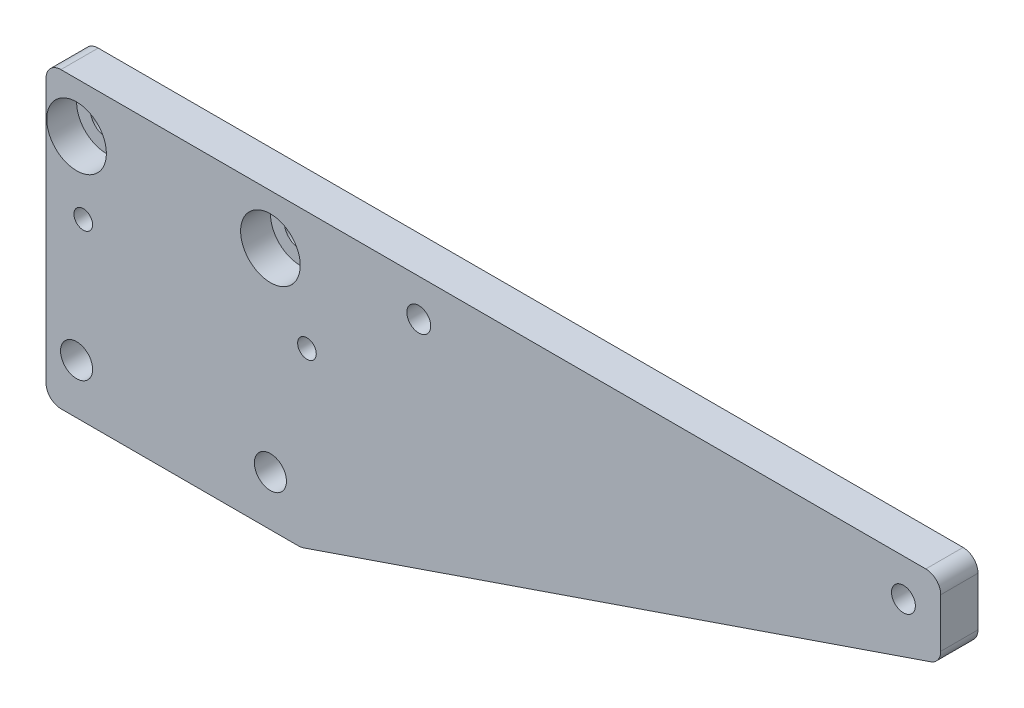
ISO-10303-21;
HEADER;
FILE_DESCRIPTION(('STEP AP214'),'2;1');
FILE_NAME('part.step','',(''),(''),'','','');
FILE_SCHEMA(('AUTOMOTIVE_DESIGN { 1 0 10303 214 1 1 1 1 }'));
ENDSEC;
DATA;
#1=APPLICATION_CONTEXT('core data for automotive mechanical design processes');
#2=APPLICATION_PROTOCOL_DEFINITION('international standard','automotive_design',2000,#1);
#3=PRODUCT_CONTEXT('',#1,'mechanical');
#4=PRODUCT('Part','Part','',(#3));
#5=PRODUCT_RELATED_PRODUCT_CATEGORY('part','',(#4));
#6=PRODUCT_DEFINITION_FORMATION('','',#4);
#7=PRODUCT_DEFINITION_CONTEXT('part definition',#1,'design');
#8=PRODUCT_DEFINITION('design','',#6,#7);
#9=PRODUCT_DEFINITION_SHAPE('','',#8);
#10=(LENGTH_UNIT() NAMED_UNIT(*) SI_UNIT(.MILLI.,.METRE.));
#11=(NAMED_UNIT(*) PLANE_ANGLE_UNIT() SI_UNIT($,.RADIAN.));
#12=(NAMED_UNIT(*) SI_UNIT($,.STERADIAN.) SOLID_ANGLE_UNIT());
#13=UNCERTAINTY_MEASURE_WITH_UNIT(LENGTH_MEASURE(1.E-05),#10,'distance_accuracy_value','');
#14=(GEOMETRIC_REPRESENTATION_CONTEXT(3) GLOBAL_UNCERTAINTY_ASSIGNED_CONTEXT((#13)) GLOBAL_UNIT_ASSIGNED_CONTEXT((#10,
#11,#12)) REPRESENTATION_CONTEXT('',''));
#15=CARTESIAN_POINT('',(0.,0.,0.));
#16=DIRECTION('',(0.,0.,1.));
#17=DIRECTION('',(1.,0.,0.));
#18=AXIS2_PLACEMENT_3D('',#15,#16,#17);
#19=CARTESIAN_POINT('',(-17.1,-19.7,5.));
#20=DIRECTION('',(1.,0.,0.));
#21=DIRECTION('',(0.,0.,-1.));
#22=AXIS2_PLACEMENT_3D('',#19,#20,#21);
#23=PLANE('',#22);
#24=DIRECTION('',(0.,-1.,0.));
#25=VECTOR('',#24,1.);
#26=CARTESIAN_POINT('',(-17.1,-19.7,0.));
#27=LINE('',#26,#25);
#28=CARTESIAN_POINT('',(-17.1,17.7,0.));
#29=VERTEX_POINT('',#28);
#30=CARTESIAN_POINT('',(-17.1,-17.7,0.));
#31=VERTEX_POINT('',#30);
#32=EDGE_CURVE('E224',#29,#31,#27,.T.);
#33=ORIENTED_EDGE('',*,*,#32,.T.);
#34=DIRECTION('',(0.,0.,-1.));
#35=VECTOR('',#34,1.);
#36=CARTESIAN_POINT('',(-17.1,-17.7,5.));
#37=LINE('',#36,#35);
#38=CARTESIAN_POINT('',(-17.1,-17.7,5.));
#39=VERTEX_POINT('',#38);
#40=EDGE_CURVE('E200',#31,#39,#37,.F.);
#41=ORIENTED_EDGE('',*,*,#40,.T.);
#42=DIRECTION('',(0.,-1.,0.));
#43=VECTOR('',#42,1.);
#44=CARTESIAN_POINT('',(-17.1,-19.7,5.));
#45=LINE('',#44,#43);
#46=CARTESIAN_POINT('',(-17.1,17.7,5.));
#47=VERTEX_POINT('',#46);
#48=EDGE_CURVE('E152',#47,#39,#45,.T.);
#49=ORIENTED_EDGE('',*,*,#48,.F.);
#50=DIRECTION('',(0.,0.,-1.));
#51=VECTOR('',#50,1.);
#52=CARTESIAN_POINT('',(-17.1,17.7,5.));
#53=LINE('',#52,#51);
#54=EDGE_CURVE('E196',#47,#29,#53,.T.);
#55=ORIENTED_EDGE('',*,*,#54,.T.);
#56=EDGE_LOOP('',(#33,#41,#49,#55));
#57=FACE_BOUND('',#56,.T.);
#58=ADVANCED_FACE('F39',(#57),#23,.F.);
#59=CARTESIAN_POINT('',(17.1,-19.7,5.));
#60=DIRECTION('',(0.,1.,0.));
#61=DIRECTION('',(-1.,0.,0.));
#62=AXIS2_PLACEMENT_3D('',#59,#60,#61);
#63=PLANE('',#62);
#64=DIRECTION('',(1.,0.,0.));
#65=VECTOR('',#64,1.);
#66=CARTESIAN_POINT('',(17.1,-19.7,0.));
#67=LINE('',#66,#65);
#68=CARTESIAN_POINT('',(-15.1,-19.7,0.));
#69=VERTEX_POINT('',#68);
#70=CARTESIAN_POINT('',(16.7668504253751,-19.7,0.));
#71=VERTEX_POINT('',#70);
#72=EDGE_CURVE('E154',#69,#71,#67,.T.);
#73=ORIENTED_EDGE('',*,*,#72,.T.);
#74=DIRECTION('',(0.,0.,-1.));
#75=VECTOR('',#74,1.);
#76=CARTESIAN_POINT('',(16.7668504253751,-19.7,5.));
#77=LINE('',#76,#75);
#78=CARTESIAN_POINT('',(16.7668504253751,-19.7,5.));
#79=VERTEX_POINT('',#78);
#80=EDGE_CURVE('E193',#71,#79,#77,.F.);
#81=ORIENTED_EDGE('',*,*,#80,.T.);
#82=DIRECTION('',(1.,0.,0.));
#83=VECTOR('',#82,1.);
#84=CARTESIAN_POINT('',(17.1,-19.7,5.));
#85=LINE('',#84,#83);
#86=CARTESIAN_POINT('',(-15.1,-19.7,5.));
#87=VERTEX_POINT('',#86);
#88=EDGE_CURVE('E211',#87,#79,#85,.T.);
#89=ORIENTED_EDGE('',*,*,#88,.F.);
#90=DIRECTION('',(0.,0.,-1.));
#91=VECTOR('',#90,1.);
#92=CARTESIAN_POINT('',(-15.1,-19.7,5.));
#93=LINE('',#92,#91);
#94=EDGE_CURVE('E189',#87,#69,#93,.T.);
#95=ORIENTED_EDGE('',*,*,#94,.T.);
#96=EDGE_LOOP('',(#73,#81,#89,#95));
#97=FACE_BOUND('',#96,.T.);
#98=ADVANCED_FACE('F232',(#97),#63,.F.);
#99=CARTESIAN_POINT('',(102.9,9.7,5.));
#100=DIRECTION('',(-0.324155188811255,0.94600391836754,0.));
#101=DIRECTION('',(-0.94600391836754,-0.324155188811255,0.));
#102=AXIS2_PLACEMENT_3D('',#99,#100,#101);
#103=PLANE('',#102);
#104=DIRECTION('',(0.94600391836754,0.324155188811255,0.));
#105=VECTOR('',#104,1.);
#106=CARTESIAN_POINT('',(102.9,9.7,0.));
#107=LINE('',#106,#105);
#108=CARTESIAN_POINT('',(17.4151608029976,-19.5920078367351,0.));
#109=VERTEX_POINT('',#108);
#110=CARTESIAN_POINT('',(101.548310377622,9.23683362589862,0.));
#111=VERTEX_POINT('',#110);
#112=EDGE_CURVE('E148',#109,#111,#107,.T.);
#113=ORIENTED_EDGE('',*,*,#112,.T.);
#114=DIRECTION('',(0.,0.,-1.));
#115=VECTOR('',#114,1.);
#116=CARTESIAN_POINT('',(101.548310377622,9.23683362589862,5.));
#117=LINE('',#116,#115);
#118=CARTESIAN_POINT('',(101.548310377622,9.23683362589862,5.));
#119=VERTEX_POINT('',#118);
#120=EDGE_CURVE('E123',#111,#119,#117,.F.);
#121=ORIENTED_EDGE('',*,*,#120,.T.);
#122=DIRECTION('',(0.94600391836754,0.324155188811255,0.));
#123=VECTOR('',#122,1.);
#124=CARTESIAN_POINT('',(102.9,9.7,5.));
#125=LINE('',#124,#123);
#126=CARTESIAN_POINT('',(17.4151608029976,-19.5920078367351,5.));
#127=VERTEX_POINT('',#126);
#128=EDGE_CURVE('E207',#127,#119,#125,.T.);
#129=ORIENTED_EDGE('',*,*,#128,.F.);
#130=DIRECTION('',(0.,0.,-1.));
#131=VECTOR('',#130,1.);
#132=CARTESIAN_POINT('',(17.4151608029976,-19.5920078367351,5.));
#133=LINE('',#132,#131);
#134=EDGE_CURVE('E129',#127,#109,#133,.T.);
#135=ORIENTED_EDGE('',*,*,#134,.T.);
#136=EDGE_LOOP('',(#113,#121,#129,#135));
#137=FACE_BOUND('',#136,.T.);
#138=ADVANCED_FACE('F242',(#137),#103,.F.);
#139=CARTESIAN_POINT('',(102.9,19.7,5.));
#140=DIRECTION('',(-1.,0.,0.));
#141=DIRECTION('',(0.,0.,1.));
#142=AXIS2_PLACEMENT_3D('',#139,#140,#141);
#143=PLANE('',#142);
#144=DIRECTION('',(0.,1.,0.));
#145=VECTOR('',#144,1.);
#146=CARTESIAN_POINT('',(102.9,19.7,5.));
#147=LINE('',#146,#145);
#148=CARTESIAN_POINT('',(102.9,11.1288414626337,5.));
#149=VERTEX_POINT('',#148);
#150=CARTESIAN_POINT('',(102.9,17.7,5.));
#151=VERTEX_POINT('',#150);
#152=EDGE_CURVE('E138',#149,#151,#147,.T.);
#153=ORIENTED_EDGE('',*,*,#152,.F.);
#154=DIRECTION('',(0.,0.,-1.));
#155=VECTOR('',#154,1.);
#156=CARTESIAN_POINT('',(102.9,11.1288414626337,5.));
#157=LINE('',#156,#155);
#158=CARTESIAN_POINT('',(102.9,11.1288414626337,0.));
#159=VERTEX_POINT('',#158);
#160=EDGE_CURVE('E122',#149,#159,#157,.T.);
#161=ORIENTED_EDGE('',*,*,#160,.T.);
#162=DIRECTION('',(0.,1.,0.));
#163=VECTOR('',#162,1.);
#164=CARTESIAN_POINT('',(102.9,19.7,0.));
#165=LINE('',#164,#163);
#166=CARTESIAN_POINT('',(102.9,17.7,0.));
#167=VERTEX_POINT('',#166);
#168=EDGE_CURVE('E136',#159,#167,#165,.T.);
#169=ORIENTED_EDGE('',*,*,#168,.T.);
#170=DIRECTION('',(0.,0.,-1.));
#171=VECTOR('',#170,1.);
#172=CARTESIAN_POINT('',(102.9,17.7,5.));
#173=LINE('',#172,#171);
#174=EDGE_CURVE('E141',#167,#151,#173,.F.);
#175=ORIENTED_EDGE('',*,*,#174,.T.);
#176=EDGE_LOOP('',(#153,#161,#169,#175));
#177=FACE_BOUND('',#176,.T.);
#178=ADVANCED_FACE('F135',(#177),#143,.F.);
#179=CARTESIAN_POINT('',(17.1,19.7,5.));
#180=DIRECTION('',(0.,-1.,0.));
#181=DIRECTION('',(1.,0.,0.));
#182=AXIS2_PLACEMENT_3D('',#179,#180,#181);
#183=PLANE('',#182);
#184=DIRECTION('',(-1.,0.,0.));
#185=VECTOR('',#184,1.);
#186=CARTESIAN_POINT('',(17.1,19.7,5.));
#187=LINE('',#186,#185);
#188=CARTESIAN_POINT('',(100.9,19.7,5.));
#189=VERTEX_POINT('',#188);
#190=CARTESIAN_POINT('',(-15.1,19.7,5.));
#191=VERTEX_POINT('',#190);
#192=EDGE_CURVE('E159',#189,#191,#187,.T.);
#193=ORIENTED_EDGE('',*,*,#192,.F.);
#194=DIRECTION('',(0.,0.,-1.));
#195=VECTOR('',#194,1.);
#196=CARTESIAN_POINT('',(100.9,19.7,5.));
#197=LINE('',#196,#195);
#198=CARTESIAN_POINT('',(100.9,19.7,0.));
#199=VERTEX_POINT('',#198);
#200=EDGE_CURVE('E11',#189,#199,#197,.T.);
#201=ORIENTED_EDGE('',*,*,#200,.T.);
#202=DIRECTION('',(-1.,0.,0.));
#203=VECTOR('',#202,1.);
#204=CARTESIAN_POINT('',(17.1,19.7,0.));
#205=LINE('',#204,#203);
#206=CARTESIAN_POINT('',(-15.1,19.7,0.));
#207=VERTEX_POINT('',#206);
#208=EDGE_CURVE('E147',#199,#207,#205,.T.);
#209=ORIENTED_EDGE('',*,*,#208,.T.);
#210=DIRECTION('',(0.,0.,-1.));
#211=VECTOR('',#210,1.);
#212=CARTESIAN_POINT('',(-15.1,19.7,5.));
#213=LINE('',#212,#211);
#214=EDGE_CURVE('E48',#207,#191,#213,.F.);
#215=ORIENTED_EDGE('',*,*,#214,.T.);
#216=EDGE_LOOP('',(#193,#201,#209,#215));
#217=FACE_BOUND('',#216,.T.);
#218=ADVANCED_FACE('F249',(#217),#183,.F.);
#219=CARTESIAN_POINT('',(0.,0.,5.));
#220=DIRECTION('',(0.,0.,1.));
#221=DIRECTION('',(1.,0.,0.));
#222=AXIS2_PLACEMENT_3D('',#219,#220,#221);
#223=PLANE('',#222);
#224=CARTESIAN_POINT('',(97.9,14.7,5.));
#225=DIRECTION('',(0.,0.,-1.));
#226=DIRECTION('',(-1.,0.,0.));
#227=AXIS2_PLACEMENT_3D('',#224,#225,#226);
#228=CIRCLE('',#227,1.6);
#229=CARTESIAN_POINT('',(96.3,14.7,5.));
#230=VERTEX_POINT('',#229);
#231=EDGE_CURVE('E340',#230,#230,#228,.T.);
#232=ORIENTED_EDGE('',*,*,#231,.T.);
#233=EDGE_LOOP('',(#232));
#234=FACE_BOUND('',#233,.T.);
#235=CARTESIAN_POINT('',(32.9,14.7,5.));
#236=DIRECTION('',(0.,0.,-1.));
#237=DIRECTION('',(-1.,0.,0.));
#238=AXIS2_PLACEMENT_3D('',#235,#236,#237);
#239=CIRCLE('',#238,1.6);
#240=CARTESIAN_POINT('',(31.3,14.7,5.));
#241=VERTEX_POINT('',#240);
#242=EDGE_CURVE('E353',#241,#241,#239,.T.);
#243=ORIENTED_EDGE('',*,*,#242,.T.);
#244=EDGE_LOOP('',(#243));
#245=FACE_BOUND('',#244,.T.);
#246=CARTESIAN_POINT('',(-12.1,3.79999999999999,5.));
#247=DIRECTION('',(0.,0.,1.));
#248=DIRECTION('',(1.,0.,0.));
#249=AXIS2_PLACEMENT_3D('',#246,#247,#248);
#250=CIRCLE('',#249,1.25);
#251=CARTESIAN_POINT('',(-10.85,3.79999999999999,5.));
#252=VERTEX_POINT('',#251);
#253=EDGE_CURVE('E357',#252,#252,#250,.T.);
#254=ORIENTED_EDGE('',*,*,#253,.F.);
#255=EDGE_LOOP('',(#254));
#256=FACE_BOUND('',#255,.T.);
#257=CARTESIAN_POINT('',(17.9,3.8,5.));
#258=DIRECTION('',(0.,0.,1.));
#259=DIRECTION('',(1.,0.,0.));
#260=AXIS2_PLACEMENT_3D('',#257,#258,#259);
#261=CIRCLE('',#260,1.25);
#262=CARTESIAN_POINT('',(19.15,3.8,5.));
#263=VERTEX_POINT('',#262);
#264=EDGE_CURVE('E365',#263,#263,#261,.T.);
#265=ORIENTED_EDGE('',*,*,#264,.F.);
#266=EDGE_LOOP('',(#265));
#267=FACE_BOUND('',#266,.T.);
#268=CARTESIAN_POINT('',(-13.,-13.,5.));
#269=DIRECTION('',(0.,0.,1.));
#270=DIRECTION('',(1.,0.,0.));
#271=AXIS2_PLACEMENT_3D('',#268,#269,#270);
#272=CIRCLE('',#271,2.15);
#273=CARTESIAN_POINT('',(-10.85,-13.,5.));
#274=VERTEX_POINT('',#273);
#275=EDGE_CURVE('E373',#274,#274,#272,.T.);
#276=ORIENTED_EDGE('',*,*,#275,.F.);
#277=EDGE_LOOP('',(#276));
#278=FACE_BOUND('',#277,.T.);
#279=CARTESIAN_POINT('',(13.,-13.,5.));
#280=DIRECTION('',(0.,0.,1.));
#281=DIRECTION('',(1.,0.,0.));
#282=AXIS2_PLACEMENT_3D('',#279,#280,#281);
#283=CIRCLE('',#282,2.15);
#284=CARTESIAN_POINT('',(15.15,-13.,5.));
#285=VERTEX_POINT('',#284);
#286=EDGE_CURVE('E381',#285,#285,#283,.T.);
#287=ORIENTED_EDGE('',*,*,#286,.F.);
#288=EDGE_LOOP('',(#287));
#289=FACE_BOUND('',#288,.T.);
#290=CARTESIAN_POINT('',(13.,13.,5.));
#291=DIRECTION('',(0.,0.,1.));
#292=DIRECTION('',(1.,0.,0.));
#293=AXIS2_PLACEMENT_3D('',#290,#291,#292);
#294=CIRCLE('',#293,4.);
#295=CARTESIAN_POINT('',(17.,13.,5.));
#296=VERTEX_POINT('',#295);
#297=EDGE_CURVE('E389',#296,#296,#294,.T.);
#298=ORIENTED_EDGE('',*,*,#297,.F.);
#299=EDGE_LOOP('',(#298));
#300=FACE_BOUND('',#299,.T.);
#301=CARTESIAN_POINT('',(-13.,13.,5.));
#302=DIRECTION('',(0.,0.,1.));
#303=DIRECTION('',(1.,0.,0.));
#304=AXIS2_PLACEMENT_3D('',#301,#302,#303);
#305=CIRCLE('',#304,4.);
#306=CARTESIAN_POINT('',(-9.,13.,5.));
#307=VERTEX_POINT('',#306);
#308=EDGE_CURVE('E405',#307,#307,#305,.T.);
#309=ORIENTED_EDGE('',*,*,#308,.F.);
#310=EDGE_LOOP('',(#309));
#311=FACE_BOUND('',#310,.T.);
#312=ORIENTED_EDGE('',*,*,#128,.T.);
#313=CARTESIAN_POINT('',(100.9,11.1288414626337,5.));
#314=DIRECTION('',(0.,0.,1.));
#315=DIRECTION('',(1.,0.,0.));
#316=AXIS2_PLACEMENT_3D('',#313,#314,#315);
#317=CIRCLE('',#316,2.);
#318=EDGE_CURVE('E186',#119,#149,#317,.T.);
#319=ORIENTED_EDGE('',*,*,#318,.T.);
#320=ORIENTED_EDGE('',*,*,#152,.T.);
#321=CARTESIAN_POINT('',(100.9,17.7,5.));
#322=DIRECTION('',(0.,0.,1.));
#323=DIRECTION('',(1.,0.,0.));
#324=AXIS2_PLACEMENT_3D('',#321,#322,#323);
#325=CIRCLE('',#324,2.);
#326=EDGE_CURVE('E61',#151,#189,#325,.T.);
#327=ORIENTED_EDGE('',*,*,#326,.T.);
#328=ORIENTED_EDGE('',*,*,#192,.T.);
#329=CARTESIAN_POINT('',(-15.1,17.7,5.));
#330=DIRECTION('',(0.,0.,1.));
#331=DIRECTION('',(1.,0.,0.));
#332=AXIS2_PLACEMENT_3D('',#329,#330,#331);
#333=CIRCLE('',#332,2.);
#334=EDGE_CURVE('E175',#191,#47,#333,.T.);
#335=ORIENTED_EDGE('',*,*,#334,.T.);
#336=ORIENTED_EDGE('',*,*,#48,.T.);
#337=CARTESIAN_POINT('',(-15.1,-17.7,5.));
#338=DIRECTION('',(0.,0.,1.));
#339=DIRECTION('',(1.,0.,0.));
#340=AXIS2_PLACEMENT_3D('',#337,#338,#339);
#341=CIRCLE('',#340,2.);
#342=EDGE_CURVE('E180',#39,#87,#341,.T.);
#343=ORIENTED_EDGE('',*,*,#342,.T.);
#344=ORIENTED_EDGE('',*,*,#88,.T.);
#345=CARTESIAN_POINT('',(16.7668504253751,-17.7,5.));
#346=DIRECTION('',(0.,0.,1.));
#347=DIRECTION('',(1.,0.,0.));
#348=AXIS2_PLACEMENT_3D('',#345,#346,#347);
#349=CIRCLE('',#348,2.);
#350=EDGE_CURVE('E183',#79,#127,#349,.T.);
#351=ORIENTED_EDGE('',*,*,#350,.T.);
#352=EDGE_LOOP('',(#312,#319,#320,#327,#328,#335,#336,#343,#344,#351));
#353=FACE_BOUND('',#352,.T.);
#354=ADVANCED_FACE('F240',(#234,#245,#256,#267,#278,#289,#300,#311,#353),#223,.T.);
#355=CARTESIAN_POINT('',(0.,0.,0.));
#356=DIRECTION('',(0.,0.,1.));
#357=DIRECTION('',(1.,0.,0.));
#358=AXIS2_PLACEMENT_3D('',#355,#356,#357);
#359=PLANE('',#358);
#360=CARTESIAN_POINT('',(97.9,14.7,0.));
#361=DIRECTION('',(0.,0.,-1.));
#362=DIRECTION('',(-1.,0.,0.));
#363=AXIS2_PLACEMENT_3D('',#360,#361,#362);
#364=CIRCLE('',#363,1.6);
#365=CARTESIAN_POINT('',(96.3,14.7,0.));
#366=VERTEX_POINT('',#365);
#367=EDGE_CURVE('E343',#366,#366,#364,.T.);
#368=ORIENTED_EDGE('',*,*,#367,.F.);
#369=EDGE_LOOP('',(#368));
#370=FACE_BOUND('',#369,.T.);
#371=CARTESIAN_POINT('',(32.9,14.7,0.));
#372=DIRECTION('',(0.,0.,-1.));
#373=DIRECTION('',(-1.,0.,0.));
#374=AXIS2_PLACEMENT_3D('',#371,#372,#373);
#375=CIRCLE('',#374,1.6);
#376=CARTESIAN_POINT('',(31.3,14.7,0.));
#377=VERTEX_POINT('',#376);
#378=EDGE_CURVE('E347',#377,#377,#375,.T.);
#379=ORIENTED_EDGE('',*,*,#378,.F.);
#380=EDGE_LOOP('',(#379));
#381=FACE_BOUND('',#380,.T.);
#382=CARTESIAN_POINT('',(-12.1,3.79999999999999,0.));
#383=DIRECTION('',(0.,0.,1.));
#384=DIRECTION('',(1.,0.,0.));
#385=AXIS2_PLACEMENT_3D('',#382,#383,#384);
#386=CIRCLE('',#385,1.25);
#387=CARTESIAN_POINT('',(-10.85,3.79999999999999,0.));
#388=VERTEX_POINT('',#387);
#389=EDGE_CURVE('E361',#388,#388,#386,.T.);
#390=ORIENTED_EDGE('',*,*,#389,.T.);
#391=EDGE_LOOP('',(#390));
#392=FACE_BOUND('',#391,.T.);
#393=CARTESIAN_POINT('',(17.9,3.8,0.));
#394=DIRECTION('',(0.,0.,1.));
#395=DIRECTION('',(1.,0.,0.));
#396=AXIS2_PLACEMENT_3D('',#393,#394,#395);
#397=CIRCLE('',#396,1.25);
#398=CARTESIAN_POINT('',(19.15,3.8,0.));
#399=VERTEX_POINT('',#398);
#400=EDGE_CURVE('E369',#399,#399,#397,.T.);
#401=ORIENTED_EDGE('',*,*,#400,.T.);
#402=EDGE_LOOP('',(#401));
#403=FACE_BOUND('',#402,.T.);
#404=CARTESIAN_POINT('',(-13.,-13.,0.));
#405=DIRECTION('',(0.,0.,1.));
#406=DIRECTION('',(1.,0.,0.));
#407=AXIS2_PLACEMENT_3D('',#404,#405,#406);
#408=CIRCLE('',#407,2.15);
#409=CARTESIAN_POINT('',(-10.85,-13.,0.));
#410=VERTEX_POINT('',#409);
#411=EDGE_CURVE('E377',#410,#410,#408,.T.);
#412=ORIENTED_EDGE('',*,*,#411,.T.);
#413=EDGE_LOOP('',(#412));
#414=FACE_BOUND('',#413,.T.);
#415=CARTESIAN_POINT('',(13.,-13.,0.));
#416=DIRECTION('',(0.,0.,1.));
#417=DIRECTION('',(1.,0.,0.));
#418=AXIS2_PLACEMENT_3D('',#415,#416,#417);
#419=CIRCLE('',#418,2.15);
#420=CARTESIAN_POINT('',(15.15,-13.,0.));
#421=VERTEX_POINT('',#420);
#422=EDGE_CURVE('E385',#421,#421,#419,.T.);
#423=ORIENTED_EDGE('',*,*,#422,.T.);
#424=EDGE_LOOP('',(#423));
#425=FACE_BOUND('',#424,.T.);
#426=CARTESIAN_POINT('',(13.,13.,0.));
#427=DIRECTION('',(0.,0.,1.));
#428=DIRECTION('',(1.,0.,0.));
#429=AXIS2_PLACEMENT_3D('',#426,#427,#428);
#430=CIRCLE('',#429,2.15);
#431=CARTESIAN_POINT('',(15.15,13.,0.));
#432=VERTEX_POINT('',#431);
#433=EDGE_CURVE('E401',#432,#432,#430,.T.);
#434=ORIENTED_EDGE('',*,*,#433,.T.);
#435=EDGE_LOOP('',(#434));
#436=FACE_BOUND('',#435,.T.);
#437=CARTESIAN_POINT('',(-13.,13.,0.));
#438=DIRECTION('',(0.,0.,1.));
#439=DIRECTION('',(1.,0.,0.));
#440=AXIS2_PLACEMENT_3D('',#437,#438,#439);
#441=CIRCLE('',#440,2.15);
#442=CARTESIAN_POINT('',(-10.85,13.,0.));
#443=VERTEX_POINT('',#442);
#444=EDGE_CURVE('E221',#443,#443,#441,.T.);
#445=ORIENTED_EDGE('',*,*,#444,.T.);
#446=EDGE_LOOP('',(#445));
#447=FACE_BOUND('',#446,.T.);
#448=ORIENTED_EDGE('',*,*,#168,.F.);
#449=CARTESIAN_POINT('',(100.9,11.1288414626337,0.));
#450=DIRECTION('',(0.,0.,1.));
#451=DIRECTION('',(1.,0.,0.));
#452=AXIS2_PLACEMENT_3D('',#449,#450,#451);
#453=CIRCLE('',#452,2.);
#454=EDGE_CURVE('E118',#159,#111,#453,.F.);
#455=ORIENTED_EDGE('',*,*,#454,.T.);
#456=ORIENTED_EDGE('',*,*,#112,.F.);
#457=CARTESIAN_POINT('',(16.7668504253751,-17.7,0.));
#458=DIRECTION('',(0.,0.,1.));
#459=DIRECTION('',(1.,0.,0.));
#460=AXIS2_PLACEMENT_3D('',#457,#458,#459);
#461=CIRCLE('',#460,2.);
#462=EDGE_CURVE('E130',#109,#71,#461,.F.);
#463=ORIENTED_EDGE('',*,*,#462,.T.);
#464=ORIENTED_EDGE('',*,*,#72,.F.);
#465=CARTESIAN_POINT('',(-15.1,-17.7,0.));
#466=DIRECTION('',(0.,0.,1.));
#467=DIRECTION('',(1.,0.,0.));
#468=AXIS2_PLACEMENT_3D('',#465,#466,#467);
#469=CIRCLE('',#468,2.);
#470=EDGE_CURVE('E165',#69,#31,#469,.F.);
#471=ORIENTED_EDGE('',*,*,#470,.T.);
#472=ORIENTED_EDGE('',*,*,#32,.F.);
#473=CARTESIAN_POINT('',(-15.1,17.7,0.));
#474=DIRECTION('',(0.,0.,1.));
#475=DIRECTION('',(1.,0.,0.));
#476=AXIS2_PLACEMENT_3D('',#473,#474,#475);
#477=CIRCLE('',#476,2.);
#478=EDGE_CURVE('E140',#29,#207,#477,.F.);
#479=ORIENTED_EDGE('',*,*,#478,.T.);
#480=ORIENTED_EDGE('',*,*,#208,.F.);
#481=CARTESIAN_POINT('',(100.9,17.7,0.));
#482=DIRECTION('',(0.,0.,1.));
#483=DIRECTION('',(1.,0.,0.));
#484=AXIS2_PLACEMENT_3D('',#481,#482,#483);
#485=CIRCLE('',#484,2.);
#486=EDGE_CURVE('E145',#199,#167,#485,.F.);
#487=ORIENTED_EDGE('',*,*,#486,.T.);
#488=EDGE_LOOP('',(#448,#455,#456,#463,#464,#471,#472,#479,#480,#487));
#489=FACE_BOUND('',#488,.T.);
#490=ADVANCED_FACE('F143',(#370,#381,#392,#403,#414,#425,#436,#447,#489),#359,.F.);
#491=CARTESIAN_POINT('',(-13.,13.,5.));
#492=DIRECTION('',(0.,0.,1.));
#493=DIRECTION('',(1.,0.,0.));
#494=AXIS2_PLACEMENT_3D('',#491,#492,#493);
#495=CYLINDRICAL_SURFACE('',#494,2.15);
#496=ORIENTED_EDGE('',*,*,#444,.F.);
#497=EDGE_LOOP('',(#496));
#498=FACE_BOUND('',#497,.T.);
#499=CARTESIAN_POINT('',(-13.,13.,1.));
#500=DIRECTION('',(0.,0.,1.));
#501=DIRECTION('',(1.,0.,0.));
#502=AXIS2_PLACEMENT_3D('',#499,#500,#501);
#503=CIRCLE('',#502,2.15);
#504=CARTESIAN_POINT('',(-10.85,13.,1.));
#505=VERTEX_POINT('',#504);
#506=EDGE_CURVE('E412',#505,#505,#503,.T.);
#507=ORIENTED_EDGE('',*,*,#506,.T.);
#508=EDGE_LOOP('',(#507));
#509=FACE_BOUND('',#508,.T.);
#510=ADVANCED_FACE('F287',(#498,#509),#495,.F.);
#511=CARTESIAN_POINT('',(-10.85,13.,1.));
#512=DIRECTION('',(0.,0.,-1.));
#513=DIRECTION('',(-1.,0.,0.));
#514=AXIS2_PLACEMENT_3D('',#511,#512,#513);
#515=PLANE('',#514);
#516=ORIENTED_EDGE('',*,*,#506,.F.);
#517=EDGE_LOOP('',(#516));
#518=FACE_BOUND('',#517,.T.);
#519=CARTESIAN_POINT('',(-13.,13.,1.));
#520=DIRECTION('',(0.,0.,1.));
#521=DIRECTION('',(1.,0.,0.));
#522=AXIS2_PLACEMENT_3D('',#519,#520,#521);
#523=CIRCLE('',#522,4.);
#524=CARTESIAN_POINT('',(-9.,13.,1.));
#525=VERTEX_POINT('',#524);
#526=EDGE_CURVE('E409',#525,#525,#523,.T.);
#527=ORIENTED_EDGE('',*,*,#526,.T.);
#528=EDGE_LOOP('',(#527));
#529=FACE_BOUND('',#528,.T.);
#530=ADVANCED_FACE('F292',(#518,#529),#515,.F.);
#531=CARTESIAN_POINT('',(-13.,13.,5.));
#532=DIRECTION('',(0.,0.,1.));
#533=DIRECTION('',(1.,0.,0.));
#534=AXIS2_PLACEMENT_3D('',#531,#532,#533);
#535=CYLINDRICAL_SURFACE('',#534,4.);
#536=ORIENTED_EDGE('',*,*,#526,.F.);
#537=EDGE_LOOP('',(#536));
#538=FACE_BOUND('',#537,.T.);
#539=ORIENTED_EDGE('',*,*,#308,.T.);
#540=EDGE_LOOP('',(#539));
#541=FACE_BOUND('',#540,.T.);
#542=ADVANCED_FACE('F296',(#538,#541),#535,.F.);
#543=CARTESIAN_POINT('',(13.,13.,5.));
#544=DIRECTION('',(0.,0.,1.));
#545=DIRECTION('',(1.,0.,0.));
#546=AXIS2_PLACEMENT_3D('',#543,#544,#545);
#547=CYLINDRICAL_SURFACE('',#546,2.15);
#548=ORIENTED_EDGE('',*,*,#433,.F.);
#549=EDGE_LOOP('',(#548));
#550=FACE_BOUND('',#549,.T.);
#551=CARTESIAN_POINT('',(13.,13.,1.));
#552=DIRECTION('',(0.,0.,1.));
#553=DIRECTION('',(1.,0.,0.));
#554=AXIS2_PLACEMENT_3D('',#551,#552,#553);
#555=CIRCLE('',#554,2.15);
#556=CARTESIAN_POINT('',(15.15,13.,1.));
#557=VERTEX_POINT('',#556);
#558=EDGE_CURVE('E397',#557,#557,#555,.T.);
#559=ORIENTED_EDGE('',*,*,#558,.T.);
#560=EDGE_LOOP('',(#559));
#561=FACE_BOUND('',#560,.T.);
#562=ADVANCED_FACE('F300',(#550,#561),#547,.F.);
#563=CARTESIAN_POINT('',(15.15,13.,1.));
#564=DIRECTION('',(0.,0.,-1.));
#565=DIRECTION('',(-1.,0.,0.));
#566=AXIS2_PLACEMENT_3D('',#563,#564,#565);
#567=PLANE('',#566);
#568=ORIENTED_EDGE('',*,*,#558,.F.);
#569=EDGE_LOOP('',(#568));
#570=FACE_BOUND('',#569,.T.);
#571=CARTESIAN_POINT('',(13.,13.,1.));
#572=DIRECTION('',(0.,0.,1.));
#573=DIRECTION('',(1.,0.,0.));
#574=AXIS2_PLACEMENT_3D('',#571,#572,#573);
#575=CIRCLE('',#574,4.);
#576=CARTESIAN_POINT('',(17.,13.,1.));
#577=VERTEX_POINT('',#576);
#578=EDGE_CURVE('E393',#577,#577,#575,.T.);
#579=ORIENTED_EDGE('',*,*,#578,.T.);
#580=EDGE_LOOP('',(#579));
#581=FACE_BOUND('',#580,.T.);
#582=ADVANCED_FACE('F304',(#570,#581),#567,.F.);
#583=CARTESIAN_POINT('',(13.,13.,5.));
#584=DIRECTION('',(0.,0.,1.));
#585=DIRECTION('',(1.,0.,0.));
#586=AXIS2_PLACEMENT_3D('',#583,#584,#585);
#587=CYLINDRICAL_SURFACE('',#586,4.);
#588=ORIENTED_EDGE('',*,*,#578,.F.);
#589=EDGE_LOOP('',(#588));
#590=FACE_BOUND('',#589,.T.);
#591=ORIENTED_EDGE('',*,*,#297,.T.);
#592=EDGE_LOOP('',(#591));
#593=FACE_BOUND('',#592,.T.);
#594=ADVANCED_FACE('F308',(#590,#593),#587,.F.);
#595=CARTESIAN_POINT('',(13.,-13.,5.));
#596=DIRECTION('',(0.,0.,1.));
#597=DIRECTION('',(1.,0.,0.));
#598=AXIS2_PLACEMENT_3D('',#595,#596,#597);
#599=CYLINDRICAL_SURFACE('',#598,2.15);
#600=ORIENTED_EDGE('',*,*,#422,.F.);
#601=EDGE_LOOP('',(#600));
#602=FACE_BOUND('',#601,.T.);
#603=ORIENTED_EDGE('',*,*,#286,.T.);
#604=EDGE_LOOP('',(#603));
#605=FACE_BOUND('',#604,.T.);
#606=ADVANCED_FACE('F312',(#602,#605),#599,.F.);
#607=CARTESIAN_POINT('',(-13.,-13.,5.));
#608=DIRECTION('',(0.,0.,1.));
#609=DIRECTION('',(1.,0.,0.));
#610=AXIS2_PLACEMENT_3D('',#607,#608,#609);
#611=CYLINDRICAL_SURFACE('',#610,2.15);
#612=ORIENTED_EDGE('',*,*,#411,.F.);
#613=EDGE_LOOP('',(#612));
#614=FACE_BOUND('',#613,.T.);
#615=ORIENTED_EDGE('',*,*,#275,.T.);
#616=EDGE_LOOP('',(#615));
#617=FACE_BOUND('',#616,.T.);
#618=ADVANCED_FACE('F316',(#614,#617),#611,.F.);
#619=CARTESIAN_POINT('',(17.9,3.8,5.));
#620=DIRECTION('',(0.,0.,1.));
#621=DIRECTION('',(1.,0.,0.));
#622=AXIS2_PLACEMENT_3D('',#619,#620,#621);
#623=CYLINDRICAL_SURFACE('',#622,1.25);
#624=ORIENTED_EDGE('',*,*,#400,.F.);
#625=EDGE_LOOP('',(#624));
#626=FACE_BOUND('',#625,.T.);
#627=ORIENTED_EDGE('',*,*,#264,.T.);
#628=EDGE_LOOP('',(#627));
#629=FACE_BOUND('',#628,.T.);
#630=ADVANCED_FACE('F320',(#626,#629),#623,.F.);
#631=CARTESIAN_POINT('',(-12.1,3.79999999999999,5.));
#632=DIRECTION('',(0.,0.,1.));
#633=DIRECTION('',(1.,0.,0.));
#634=AXIS2_PLACEMENT_3D('',#631,#632,#633);
#635=CYLINDRICAL_SURFACE('',#634,1.25);
#636=ORIENTED_EDGE('',*,*,#389,.F.);
#637=EDGE_LOOP('',(#636));
#638=FACE_BOUND('',#637,.T.);
#639=ORIENTED_EDGE('',*,*,#253,.T.);
#640=EDGE_LOOP('',(#639));
#641=FACE_BOUND('',#640,.T.);
#642=ADVANCED_FACE('F324',(#638,#641),#635,.F.);
#643=CARTESIAN_POINT('',(32.9,14.7,0.));
#644=DIRECTION('',(0.,0.,-1.));
#645=DIRECTION('',(-1.,0.,0.));
#646=AXIS2_PLACEMENT_3D('',#643,#644,#645);
#647=CYLINDRICAL_SURFACE('',#646,1.6);
#648=ORIENTED_EDGE('',*,*,#242,.F.);
#649=EDGE_LOOP('',(#648));
#650=FACE_BOUND('',#649,.T.);
#651=ORIENTED_EDGE('',*,*,#378,.T.);
#652=EDGE_LOOP('',(#651));
#653=FACE_BOUND('',#652,.T.);
#654=ADVANCED_FACE('F328',(#650,#653),#647,.F.);
#655=CARTESIAN_POINT('',(97.9,14.7,0.));
#656=DIRECTION('',(0.,0.,-1.));
#657=DIRECTION('',(-1.,0.,0.));
#658=AXIS2_PLACEMENT_3D('',#655,#656,#657);
#659=CYLINDRICAL_SURFACE('',#658,1.6);
#660=ORIENTED_EDGE('',*,*,#231,.F.);
#661=EDGE_LOOP('',(#660));
#662=FACE_BOUND('',#661,.T.);
#663=ORIENTED_EDGE('',*,*,#367,.T.);
#664=EDGE_LOOP('',(#663));
#665=FACE_BOUND('',#664,.T.);
#666=ADVANCED_FACE('F260',(#662,#665),#659,.F.);
#667=CARTESIAN_POINT('',(100.9,11.1288414626337,5.));
#668=DIRECTION('',(0.,0.,-1.));
#669=DIRECTION('',(-1.,0.,0.));
#670=AXIS2_PLACEMENT_3D('',#667,#668,#669);
#671=CYLINDRICAL_SURFACE('',#670,2.);
#672=ORIENTED_EDGE('',*,*,#318,.F.);
#673=ORIENTED_EDGE('',*,*,#120,.F.);
#674=ORIENTED_EDGE('',*,*,#454,.F.);
#675=ORIENTED_EDGE('',*,*,#160,.F.);
#676=EDGE_LOOP('',(#672,#673,#674,#675));
#677=FACE_BOUND('',#676,.T.);
#678=ADVANCED_FACE('F121',(#677),#671,.T.);
#679=CARTESIAN_POINT('',(16.7668504253751,-17.7,5.));
#680=DIRECTION('',(0.,0.,-1.));
#681=DIRECTION('',(-1.,0.,0.));
#682=AXIS2_PLACEMENT_3D('',#679,#680,#681);
#683=CYLINDRICAL_SURFACE('',#682,2.);
#684=ORIENTED_EDGE('',*,*,#350,.F.);
#685=ORIENTED_EDGE('',*,*,#80,.F.);
#686=ORIENTED_EDGE('',*,*,#462,.F.);
#687=ORIENTED_EDGE('',*,*,#134,.F.);
#688=EDGE_LOOP('',(#684,#685,#686,#687));
#689=FACE_BOUND('',#688,.T.);
#690=ADVANCED_FACE('F237',(#689),#683,.T.);
#691=CARTESIAN_POINT('',(-15.1,-17.7,5.));
#692=DIRECTION('',(0.,0.,-1.));
#693=DIRECTION('',(-1.,0.,0.));
#694=AXIS2_PLACEMENT_3D('',#691,#692,#693);
#695=CYLINDRICAL_SURFACE('',#694,2.);
#696=ORIENTED_EDGE('',*,*,#342,.F.);
#697=ORIENTED_EDGE('',*,*,#40,.F.);
#698=ORIENTED_EDGE('',*,*,#470,.F.);
#699=ORIENTED_EDGE('',*,*,#94,.F.);
#700=EDGE_LOOP('',(#696,#697,#698,#699));
#701=FACE_BOUND('',#700,.T.);
#702=ADVANCED_FACE('F263',(#701),#695,.T.);
#703=CARTESIAN_POINT('',(100.9,17.7,5.));
#704=DIRECTION('',(0.,0.,-1.));
#705=DIRECTION('',(-1.,0.,0.));
#706=AXIS2_PLACEMENT_3D('',#703,#704,#705);
#707=CYLINDRICAL_SURFACE('',#706,2.);
#708=ORIENTED_EDGE('',*,*,#326,.F.);
#709=ORIENTED_EDGE('',*,*,#174,.F.);
#710=ORIENTED_EDGE('',*,*,#486,.F.);
#711=ORIENTED_EDGE('',*,*,#200,.F.);
#712=EDGE_LOOP('',(#708,#709,#710,#711));
#713=FACE_BOUND('',#712,.T.);
#714=ADVANCED_FACE('F265',(#713),#707,.T.);
#715=CARTESIAN_POINT('',(-15.1,17.7,5.));
#716=DIRECTION('',(0.,0.,-1.));
#717=DIRECTION('',(-1.,0.,0.));
#718=AXIS2_PLACEMENT_3D('',#715,#716,#717);
#719=CYLINDRICAL_SURFACE('',#718,2.);
#720=ORIENTED_EDGE('',*,*,#334,.F.);
#721=ORIENTED_EDGE('',*,*,#214,.F.);
#722=ORIENTED_EDGE('',*,*,#478,.F.);
#723=ORIENTED_EDGE('',*,*,#54,.F.);
#724=EDGE_LOOP('',(#720,#721,#722,#723));
#725=FACE_BOUND('',#724,.T.);
#726=ADVANCED_FACE('F41',(#725),#719,.T.);
#727=CLOSED_SHELL('',(#58,#98,#138,#178,#218,#354,#490,#510,#530,#542,#562,#582,#594,#606,#618,
#630,#642,#654,#666,#678,#690,#702,#714,#726));
#728=MANIFOLD_SOLID_BREP('B2',#727);
#729=ADVANCED_BREP_SHAPE_REPRESENTATION('',(#18,#728),#14);
#730=SHAPE_DEFINITION_REPRESENTATION(#9,#729);
ENDSEC;
END-ISO-10303-21;
